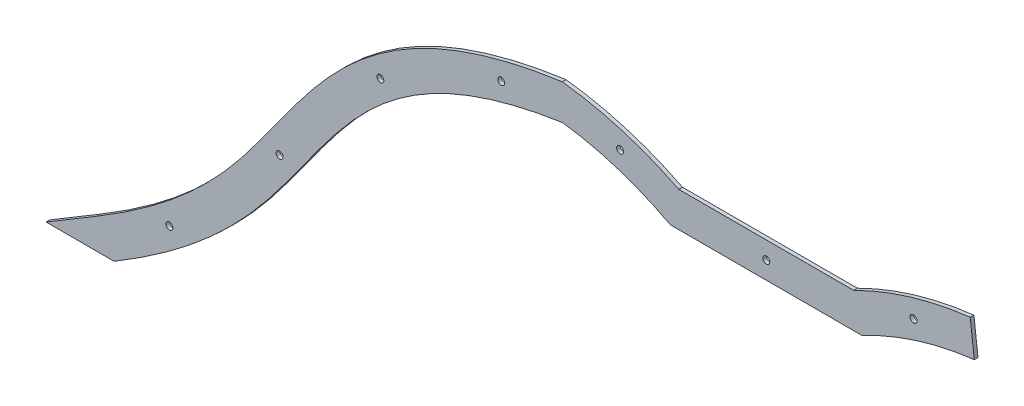
ISO-10303-21;
HEADER;
FILE_DESCRIPTION(('STEP AP214'),'2;1');
FILE_NAME('part.step','',(''),(''),'','','');
FILE_SCHEMA(('AUTOMOTIVE_DESIGN { 1 0 10303 214 1 1 1 1 }'));
ENDSEC;
DATA;
#1=APPLICATION_CONTEXT('core data for automotive mechanical design processes');
#2=APPLICATION_PROTOCOL_DEFINITION('international standard','automotive_design',2000,#1);
#3=PRODUCT_CONTEXT('',#1,'mechanical');
#4=PRODUCT('Part','Part','',(#3));
#5=PRODUCT_RELATED_PRODUCT_CATEGORY('part','',(#4));
#6=PRODUCT_DEFINITION_FORMATION('','',#4);
#7=PRODUCT_DEFINITION_CONTEXT('part definition',#1,'design');
#8=PRODUCT_DEFINITION('design','',#6,#7);
#9=PRODUCT_DEFINITION_SHAPE('','',#8);
#10=(LENGTH_UNIT() NAMED_UNIT(*) SI_UNIT(.MILLI.,.METRE.));
#11=(NAMED_UNIT(*) PLANE_ANGLE_UNIT() SI_UNIT($,.RADIAN.));
#12=(NAMED_UNIT(*) SI_UNIT($,.STERADIAN.) SOLID_ANGLE_UNIT());
#13=UNCERTAINTY_MEASURE_WITH_UNIT(LENGTH_MEASURE(1.E-05),#10,'distance_accuracy_value','');
#14=(GEOMETRIC_REPRESENTATION_CONTEXT(3) GLOBAL_UNCERTAINTY_ASSIGNED_CONTEXT((#13)) GLOBAL_UNIT_ASSIGNED_CONTEXT((#10,
#11,#12)) REPRESENTATION_CONTEXT('',''));
#15=CARTESIAN_POINT('',(0.,0.,0.));
#16=DIRECTION('',(0.,0.,1.));
#17=DIRECTION('',(1.,0.,0.));
#18=AXIS2_PLACEMENT_3D('',#15,#16,#17);
#19=CARTESIAN_POINT('',(-305.730376042937,66.0922491219474,3.175));
#20=DIRECTION('',(0.,0.,-1.));
#21=DIRECTION('',(-1.,0.,0.));
#22=AXIS2_PLACEMENT_3D('',#19,#20,#21);
#23=PLANE('',#22);
#24=CARTESIAN_POINT('',(226.311251147047,174.5053286279,3.175));
#25=DIRECTION('',(0.,0.,1.));
#26=DIRECTION('',(1.,0.,0.));
#27=AXIS2_PLACEMENT_3D('',#24,#25,#26);
#28=CIRCLE('',#27,2.99999999999999);
#29=CARTESIAN_POINT('',(229.311251147047,174.5053286279,3.175));
#30=VERTEX_POINT('',#29);
#31=EDGE_CURVE('E304',#30,#30,#28,.T.);
#32=ORIENTED_EDGE('',*,*,#31,.F.);
#33=EDGE_LOOP('',(#32));
#34=FACE_BOUND('',#33,.T.);
#35=CARTESIAN_POINT('',(-127.411512688745,174.255628939534,3.175));
#36=DIRECTION('',(0.,0.,1.));
#37=DIRECTION('',(1.,0.,0.));
#38=AXIS2_PLACEMENT_3D('',#35,#36,#37);
#39=CIRCLE('',#38,3.00000000000001);
#40=CARTESIAN_POINT('',(-124.411512688745,174.255628939534,3.175));
#41=VERTEX_POINT('',#40);
#42=EDGE_CURVE('E316',#41,#41,#39,.T.);
#43=ORIENTED_EDGE('',*,*,#42,.F.);
#44=EDGE_LOOP('',(#43));
#45=FACE_BOUND('',#44,.T.);
#46=CARTESIAN_POINT('',(-317.601811803088,24.2556289395343,3.175));
#47=DIRECTION('',(0.,0.,1.));
#48=DIRECTION('',(1.,0.,0.));
#49=AXIS2_PLACEMENT_3D('',#46,#47,#48);
#50=CIRCLE('',#49,2.99999999999999);
#51=CARTESIAN_POINT('',(-314.601811803088,24.2556289395343,3.175));
#52=VERTEX_POINT('',#51);
#53=EDGE_CURVE('E328',#52,#52,#50,.T.);
#54=ORIENTED_EDGE('',*,*,#53,.F.);
#55=EDGE_LOOP('',(#54));
#56=FACE_BOUND('',#55,.T.);
#57=CARTESIAN_POINT('',(-74.9999999999999,200.,3.175));
#58=CARTESIAN_POINT('',(-257.635554762002,174.287094015671,3.175));
#59=CARTESIAN_POINT('',(-306.013905785091,34.0368017017092,3.175));
#60=CARTESIAN_POINT('',(-419.540575808605,-66.8200706837091,3.175));
#61=CARTESIAN_POINT('',(-475.,-100.,3.175));
#62=B_SPLINE_CURVE_WITH_KNOTS('',3,(#57,#58,#59,#60,#61),.UNSPECIFIED.,.F.,.F.,(4,1,4),(0.,
0.687776101030099,1.),.UNSPECIFIED.);
#63=CARTESIAN_POINT('',(-75.0000000000001,200.,3.175));
#64=VERTEX_POINT('',#63);
#65=CARTESIAN_POINT('',(-475.,-100.,3.175));
#66=VERTEX_POINT('',#65);
#67=EDGE_CURVE('E180',#64,#66,#62,.T.);
#68=ORIENTED_EDGE('',*,*,#67,.T.);
#69=DIRECTION('',(-0.858145702015522,-0.513406227184953,0.));
#70=VECTOR('',#69,1.);
#71=CARTESIAN_POINT('',(-475.,-100.,3.175));
#72=LINE('',#71,#70);
#73=CARTESIAN_POINT('',(-518.031074043971,-125.744371060466,3.175));
#74=VERTEX_POINT('',#73);
#75=EDGE_CURVE('E103',#66,#74,#72,.T.);
#76=ORIENTED_EDGE('',*,*,#75,.T.);
#77=DIRECTION('',(1.,0.,0.));
#78=VECTOR('',#77,1.);
#79=CARTESIAN_POINT('',(-518.031074043971,-125.744371060466,3.175));
#80=LINE('',#79,#78);
#81=CARTESIAN_POINT('',(-459.597813184451,-125.744371060466,3.175));
#82=VERTEX_POINT('',#81);
#83=EDGE_CURVE('E204',#74,#82,#80,.T.);
#84=ORIENTED_EDGE('',*,*,#83,.T.);
#85=CARTESIAN_POINT('',(-459.597813184451,-125.744371060466,3.175));
#86=CARTESIAN_POINT('',(-458.167847661008,-124.888859924453,3.175));
#87=CARTESIAN_POINT('',(-455.300989910978,-123.160410803512,3.175));
#88=CARTESIAN_POINT('',(-449.693031194382,-119.725805066195,3.175));
#89=CARTESIAN_POINT('',(-442.844497858385,-115.430194442827,3.175));
#90=CARTESIAN_POINT('',(-434.897527212848,-110.280573748459,3.175));
#91=CARTESIAN_POINT('',(-424.643042918718,-103.410605597608,3.175));
#92=CARTESIAN_POINT('',(-412.446207366318,-94.8074073361384,3.175));
#93=CARTESIAN_POINT('',(-398.732866919874,-84.4254599712683,3.175));
#94=CARTESIAN_POINT('',(-385.875530013984,-73.9566558324273,3.175));
#95=CARTESIAN_POINT('',(-369.787206696001,-59.8500462059188,3.175));
#96=CARTESIAN_POINT('',(-355.152571956072,-45.4768028345298,3.175));
#97=CARTESIAN_POINT('',(-341.718077927236,-30.7847447708396,3.175));
#98=CARTESIAN_POINT('',(-332.160906415082,-19.5811865479318,3.175));
#99=CARTESIAN_POINT('',(-323.101555816333,-8.24103468343101,3.175));
#100=CARTESIAN_POINT('',(-311.63081691185,6.86364977739034,3.175));
#101=CARTESIAN_POINT('',(-298.117522757958,25.6059909159941,3.175));
#102=CARTESIAN_POINT('',(-282.395742384374,47.4315622052112,3.175));
#103=CARTESIAN_POINT('',(-266.384320483002,68.2509902397383,3.175));
#104=CARTESIAN_POINT('',(-249.341239770055,87.8033959609906,3.175));
#105=CARTESIAN_POINT('',(-230.504956306007,105.928130355789,3.175));
#106=CARTESIAN_POINT('',(-212.601243200538,119.77401821188,3.175));
#107=CARTESIAN_POINT('',(-196.457396920586,130.048920131079,3.175));
#108=CARTESIAN_POINT('',(-183.303935629057,137.332054250385,3.175));
#109=CARTESIAN_POINT('',(-168.969219752467,144.162376513778,3.175));
#110=CARTESIAN_POINT('',(-153.317967867507,150.500059010119,3.175));
#111=CARTESIAN_POINT('',(-136.218766866544,156.296597686252,3.175));
#112=CARTESIAN_POINT('',(-120.658812709165,160.629761276106,3.175));
#113=CARTESIAN_POINT('',(-107.364076992739,163.767973942765,3.175));
#114=CARTESIAN_POINT('',(-96.9585151839107,165.949209965446,3.175));
#115=CARTESIAN_POINT('',(-87.9034354353755,167.618170458525,3.175));
#116=CARTESIAN_POINT('',(-80.4452519010198,168.856738215602,3.175));
#117=CARTESIAN_POINT('',(-76.6048102728112,169.448930821223,3.175));
#118=CARTESIAN_POINT('',(-74.6960572886798,169.732215312606,3.175));
#119=B_SPLINE_CURVE_WITH_KNOTS('',3,(#85,#86,#87,#88,#89,#90,#91,#92,#93,#94,#95,#96,#97,#98,
#99,#100,#101,#102,#103,#104,#105,#106,#107,#108,#109,#110,#111,#112,#113,#114,#115,#116,#117,
#118),.UNSPECIFIED.,.F.,.F.,(4,1,1,1,1,1,1,1,1,1,1,1,1,1,1,1,1,1,1,1,1,1,1,1,1,1,1,1,1,1,1,4),
(0.,0.00777204129202768,0.0155440825840554,0.0310881651681107,0.0466322477521661,
0.0621763303362214,0.0932644955043321,0.124352660672443,0.155440825840554,0.186528991008664,
0.248705321344886,0.279793486512996,0.310881651681107,0.341969816849218,0.373057982017328,
0.43523431235355,0.497410642689771,0.559586973025993,0.621763303362214,0.683939633698435,
0.746115964034657,0.777204129202768,0.808292294370878,0.839380459538989,0.8704686247071,
0.90155678987521,0.932644955043321,0.948189037627376,0.963733120211432,0.979277202795487,
0.987049244087515,0.994821285379543),.UNSPECIFIED.);
#120=CARTESIAN_POINT('',(-74.6960572886798,169.732215312606,3.175));
#121=VERTEX_POINT('',#120);
#122=EDGE_CURVE('E223',#82,#121,#119,.T.);
#123=ORIENTED_EDGE('',*,*,#122,.T.);
#124=CARTESIAN_POINT('',(-109.889296501682,-97.9643216722729,3.175));
#125=DIRECTION('',(0.,0.,-1.));
#126=DIRECTION('',(-1.,0.,0.));
#127=AXIS2_PLACEMENT_3D('',#124,#125,#126);
#128=CIRCLE('',#127,270.);
#129=CARTESIAN_POINT('',(17.6763007847929,140.,3.175));
#130=VERTEX_POINT('',#129);
#131=EDGE_CURVE('E220',#121,#130,#128,.T.);
#132=ORIENTED_EDGE('',*,*,#131,.T.);
#133=DIRECTION('',(1.,0.,0.));
#134=VECTOR('',#133,1.);
#135=CARTESIAN_POINT('',(17.6763007847929,140.,3.175));
#136=LINE('',#135,#134);
#137=CARTESIAN_POINT('',(182.323699215207,140.,3.175));
#138=VERTEX_POINT('',#137);
#139=EDGE_CURVE('E222',#130,#138,#136,.T.);
#140=ORIENTED_EDGE('',*,*,#139,.T.);
#141=CARTESIAN_POINT('',(309.889296501682,-97.9643216722729,3.175));
#142=DIRECTION('',(0.,0.,-1.));
#143=DIRECTION('',(-1.,0.,0.));
#144=AXIS2_PLACEMENT_3D('',#141,#142,#143);
#145=CIRCLE('',#144,270.);
#146=CARTESIAN_POINT('',(278.488929650168,170.203567832773,3.175));
#147=VERTEX_POINT('',#146);
#148=EDGE_CURVE('E225',#138,#147,#145,.T.);
#149=ORIENTED_EDGE('',*,*,#148,.T.);
#150=DIRECTION('',(-0.116297655005604,0.993214405574243,0.));
#151=VECTOR('',#150,1.);
#152=CARTESIAN_POINT('',(278.488929650168,170.203567832773,3.175));
#153=LINE('',#152,#151);
#154=CARTESIAN_POINT('',(275.,200.,3.175));
#155=VERTEX_POINT('',#154);
#156=EDGE_CURVE('E131',#147,#155,#153,.T.);
#157=ORIENTED_EDGE('',*,*,#156,.T.);
#158=CARTESIAN_POINT('',(309.889296501682,-97.9643216722729,3.175));
#159=DIRECTION('',(0.,0.,1.));
#160=DIRECTION('',(-1.,0.,0.));
#161=AXIS2_PLACEMENT_3D('',#158,#159,#160);
#162=CIRCLE('',#161,300.);
#163=CARTESIAN_POINT('',(175.,170.,3.175));
#164=VERTEX_POINT('',#163);
#165=EDGE_CURVE('E125',#155,#164,#162,.T.);
#166=ORIENTED_EDGE('',*,*,#165,.T.);
#167=DIRECTION('',(-1.,0.,0.));
#168=VECTOR('',#167,1.);
#169=CARTESIAN_POINT('',(25.,170.,3.175));
#170=LINE('',#169,#168);
#171=CARTESIAN_POINT('',(25.,170.,3.175));
#172=VERTEX_POINT('',#171);
#173=EDGE_CURVE('E129',#164,#172,#170,.T.);
#174=ORIENTED_EDGE('',*,*,#173,.T.);
#175=CARTESIAN_POINT('',(-109.889296501682,-97.9643216722729,3.175));
#176=DIRECTION('',(0.,0.,1.));
#177=DIRECTION('',(-1.,0.,0.));
#178=AXIS2_PLACEMENT_3D('',#175,#176,#177);
#179=CIRCLE('',#178,300.);
#180=EDGE_CURVE('E51',#172,#64,#179,.T.);
#181=ORIENTED_EDGE('',*,*,#180,.T.);
#182=EDGE_LOOP('',(#68,#76,#84,#123,#132,#140,#149,#157,#166,#174,#181));
#183=FACE_BOUND('',#182,.T.);
#184=CARTESIAN_POINT('',(-412.17449942756,-75.7443710604656,3.175));
#185=DIRECTION('',(0.,0.,1.));
#186=DIRECTION('',(1.,0.,0.));
#187=AXIS2_PLACEMENT_3D('',#184,#185,#186);
#188=CIRCLE('',#187,2.99999999999999);
#189=CARTESIAN_POINT('',(-409.17449942756,-75.7443710604656,3.175));
#190=VERTEX_POINT('',#189);
#191=EDGE_CURVE('E155',#190,#190,#188,.T.);
#192=ORIENTED_EDGE('',*,*,#191,.F.);
#193=EDGE_LOOP('',(#192));
#194=FACE_BOUND('',#193,.T.);
#195=CARTESIAN_POINT('',(-231.096695012499,124.255628939534,3.175));
#196=DIRECTION('',(0.,0.,1.));
#197=DIRECTION('',(1.,0.,0.));
#198=AXIS2_PLACEMENT_3D('',#195,#196,#197);
#199=CIRCLE('',#198,2.99999999999999);
#200=CARTESIAN_POINT('',(-228.096695012499,124.255628939534,3.175));
#201=VERTEX_POINT('',#200);
#202=EDGE_CURVE('E322',#201,#201,#199,.T.);
#203=ORIENTED_EDGE('',*,*,#202,.F.);
#204=EDGE_LOOP('',(#203));
#205=FACE_BOUND('',#204,.T.);
#206=CARTESIAN_POINT('',(100.,155.,3.175));
#207=DIRECTION('',(0.,0.,1.));
#208=DIRECTION('',(1.,0.,0.));
#209=AXIS2_PLACEMENT_3D('',#206,#207,#208);
#210=CIRCLE('',#209,3.00000000000001);
#211=CARTESIAN_POINT('',(103.,155.,3.175));
#212=VERTEX_POINT('',#211);
#213=EDGE_CURVE('E310',#212,#212,#210,.T.);
#214=ORIENTED_EDGE('',*,*,#213,.F.);
#215=EDGE_LOOP('',(#214));
#216=FACE_BOUND('',#215,.T.);
#217=CARTESIAN_POINT('',(-25.3925832180808,174.221837866137,3.175));
#218=DIRECTION('',(0.,0.,1.));
#219=DIRECTION('',(1.,0.,0.));
#220=AXIS2_PLACEMENT_3D('',#217,#218,#219);
#221=CIRCLE('',#220,3.);
#222=CARTESIAN_POINT('',(-22.3925832180808,174.221837866137,3.175));
#223=VERTEX_POINT('',#222);
#224=EDGE_CURVE('E295',#223,#223,#221,.T.);
#225=ORIENTED_EDGE('',*,*,#224,.F.);
#226=EDGE_LOOP('',(#225));
#227=FACE_BOUND('',#226,.T.);
#228=ADVANCED_FACE('F33',(#34,#45,#56,#183,#194,#205,#216,#227),#23,.F.);
#229=CARTESIAN_POINT('',(-305.730376042937,66.0922491219474,0.));
#230=DIRECTION('',(0.,0.,-1.));
#231=DIRECTION('',(-1.,0.,0.));
#232=AXIS2_PLACEMENT_3D('',#229,#230,#231);
#233=PLANE('',#232);
#234=CARTESIAN_POINT('',(226.311251147047,174.5053286279,0.));
#235=DIRECTION('',(0.,0.,1.));
#236=DIRECTION('',(1.,0.,0.));
#237=AXIS2_PLACEMENT_3D('',#234,#235,#236);
#238=CIRCLE('',#237,2.99999999999999);
#239=CARTESIAN_POINT('',(229.311251147047,174.5053286279,0.));
#240=VERTEX_POINT('',#239);
#241=EDGE_CURVE('E301',#240,#240,#238,.T.);
#242=ORIENTED_EDGE('',*,*,#241,.T.);
#243=EDGE_LOOP('',(#242));
#244=FACE_BOUND('',#243,.T.);
#245=CARTESIAN_POINT('',(-127.411512688745,174.255628939534,0.));
#246=DIRECTION('',(0.,0.,1.));
#247=DIRECTION('',(1.,0.,0.));
#248=AXIS2_PLACEMENT_3D('',#245,#246,#247);
#249=CIRCLE('',#248,3.00000000000001);
#250=CARTESIAN_POINT('',(-124.411512688745,174.255628939534,0.));
#251=VERTEX_POINT('',#250);
#252=EDGE_CURVE('E313',#251,#251,#249,.T.);
#253=ORIENTED_EDGE('',*,*,#252,.T.);
#254=EDGE_LOOP('',(#253));
#255=FACE_BOUND('',#254,.T.);
#256=CARTESIAN_POINT('',(-317.601811803088,24.2556289395343,0.));
#257=DIRECTION('',(0.,0.,1.));
#258=DIRECTION('',(1.,0.,0.));
#259=AXIS2_PLACEMENT_3D('',#256,#257,#258);
#260=CIRCLE('',#259,2.99999999999999);
#261=CARTESIAN_POINT('',(-314.601811803088,24.2556289395343,0.));
#262=VERTEX_POINT('',#261);
#263=EDGE_CURVE('E325',#262,#262,#260,.T.);
#264=ORIENTED_EDGE('',*,*,#263,.T.);
#265=EDGE_LOOP('',(#264));
#266=FACE_BOUND('',#265,.T.);
#267=CARTESIAN_POINT('',(-74.9999999999999,200.,0.));
#268=CARTESIAN_POINT('',(-257.635554762002,174.287094015671,0.));
#269=CARTESIAN_POINT('',(-306.013905785091,34.0368017017092,0.));
#270=CARTESIAN_POINT('',(-419.540575808605,-66.8200706837091,0.));
#271=CARTESIAN_POINT('',(-475.,-100.,0.));
#272=B_SPLINE_CURVE_WITH_KNOTS('',3,(#267,#268,#269,#270,#271),.UNSPECIFIED.,.F.,.F.,(4,1,4),
(0.,0.687776101030099,1.),.UNSPECIFIED.);
#273=CARTESIAN_POINT('',(-75.0000000000001,200.,0.));
#274=VERTEX_POINT('',#273);
#275=CARTESIAN_POINT('',(-475.,-100.,0.));
#276=VERTEX_POINT('',#275);
#277=EDGE_CURVE('E149',#274,#276,#272,.T.);
#278=ORIENTED_EDGE('',*,*,#277,.F.);
#279=CARTESIAN_POINT('',(-109.889296501682,-97.9643216722729,0.));
#280=DIRECTION('',(0.,0.,1.));
#281=DIRECTION('',(-1.,0.,0.));
#282=AXIS2_PLACEMENT_3D('',#279,#280,#281);
#283=CIRCLE('',#282,300.);
#284=CARTESIAN_POINT('',(25.,170.,0.));
#285=VERTEX_POINT('',#284);
#286=EDGE_CURVE('E95',#285,#274,#283,.T.);
#287=ORIENTED_EDGE('',*,*,#286,.F.);
#288=DIRECTION('',(-1.,0.,0.));
#289=VECTOR('',#288,1.);
#290=CARTESIAN_POINT('',(25.,170.,0.));
#291=LINE('',#290,#289);
#292=CARTESIAN_POINT('',(175.,170.,0.));
#293=VERTEX_POINT('',#292);
#294=EDGE_CURVE('E89',#293,#285,#291,.T.);
#295=ORIENTED_EDGE('',*,*,#294,.F.);
#296=CARTESIAN_POINT('',(309.889296501682,-97.9643216722729,0.));
#297=DIRECTION('',(0.,0.,1.));
#298=DIRECTION('',(-1.,0.,0.));
#299=AXIS2_PLACEMENT_3D('',#296,#297,#298);
#300=CIRCLE('',#299,300.);
#301=CARTESIAN_POINT('',(275.,200.,0.));
#302=VERTEX_POINT('',#301);
#303=EDGE_CURVE('E139',#302,#293,#300,.T.);
#304=ORIENTED_EDGE('',*,*,#303,.F.);
#305=DIRECTION('',(-0.116297655005604,0.993214405574243,0.));
#306=VECTOR('',#305,1.);
#307=CARTESIAN_POINT('',(278.488929650168,170.203567832773,0.));
#308=LINE('',#307,#306);
#309=CARTESIAN_POINT('',(278.488929650168,170.203567832773,0.));
#310=VERTEX_POINT('',#309);
#311=EDGE_CURVE('E175',#310,#302,#308,.T.);
#312=ORIENTED_EDGE('',*,*,#311,.F.);
#313=CARTESIAN_POINT('',(309.889296501682,-97.9643216722729,0.));
#314=DIRECTION('',(0.,0.,-1.));
#315=DIRECTION('',(-1.,0.,0.));
#316=AXIS2_PLACEMENT_3D('',#313,#314,#315);
#317=CIRCLE('',#316,270.);
#318=CARTESIAN_POINT('',(182.323699215207,140.,0.));
#319=VERTEX_POINT('',#318);
#320=EDGE_CURVE('E173',#319,#310,#317,.T.);
#321=ORIENTED_EDGE('',*,*,#320,.F.);
#322=DIRECTION('',(1.,0.,0.));
#323=VECTOR('',#322,1.);
#324=CARTESIAN_POINT('',(17.6763007847929,140.,0.));
#325=LINE('',#324,#323);
#326=CARTESIAN_POINT('',(17.6763007847929,140.,0.));
#327=VERTEX_POINT('',#326);
#328=EDGE_CURVE('E171',#327,#319,#325,.T.);
#329=ORIENTED_EDGE('',*,*,#328,.F.);
#330=CARTESIAN_POINT('',(-109.889296501682,-97.9643216722729,0.));
#331=DIRECTION('',(0.,0.,-1.));
#332=DIRECTION('',(-1.,0.,0.));
#333=AXIS2_PLACEMENT_3D('',#330,#331,#332);
#334=CIRCLE('',#333,270.);
#335=CARTESIAN_POINT('',(-74.6960572886798,169.732215312606,0.));
#336=VERTEX_POINT('',#335);
#337=EDGE_CURVE('E166',#336,#327,#334,.T.);
#338=ORIENTED_EDGE('',*,*,#337,.F.);
#339=CARTESIAN_POINT('',(-459.597813184451,-125.744371060466,0.));
#340=CARTESIAN_POINT('',(-458.167847661008,-124.888859924453,0.));
#341=CARTESIAN_POINT('',(-455.300989910978,-123.160410803512,0.));
#342=CARTESIAN_POINT('',(-449.693031194382,-119.725805066195,0.));
#343=CARTESIAN_POINT('',(-442.844497858385,-115.430194442827,0.));
#344=CARTESIAN_POINT('',(-434.897527212848,-110.280573748459,0.));
#345=CARTESIAN_POINT('',(-424.643042918718,-103.410605597608,0.));
#346=CARTESIAN_POINT('',(-412.446207366318,-94.8074073361384,0.));
#347=CARTESIAN_POINT('',(-398.732866919874,-84.4254599712683,0.));
#348=CARTESIAN_POINT('',(-385.875530013984,-73.9566558324273,0.));
#349=CARTESIAN_POINT('',(-369.787206696001,-59.8500462059188,0.));
#350=CARTESIAN_POINT('',(-355.152571956072,-45.4768028345298,0.));
#351=CARTESIAN_POINT('',(-341.718077927236,-30.7847447708396,0.));
#352=CARTESIAN_POINT('',(-332.160906415082,-19.5811865479318,0.));
#353=CARTESIAN_POINT('',(-323.101555816333,-8.24103468343101,0.));
#354=CARTESIAN_POINT('',(-311.63081691185,6.86364977739034,0.));
#355=CARTESIAN_POINT('',(-298.117522757958,25.6059909159941,0.));
#356=CARTESIAN_POINT('',(-282.395742384374,47.4315622052112,0.));
#357=CARTESIAN_POINT('',(-266.384320483002,68.2509902397383,0.));
#358=CARTESIAN_POINT('',(-249.341239770055,87.8033959609906,0.));
#359=CARTESIAN_POINT('',(-230.504956306007,105.928130355789,0.));
#360=CARTESIAN_POINT('',(-212.601243200538,119.77401821188,0.));
#361=CARTESIAN_POINT('',(-196.457396920586,130.048920131079,0.));
#362=CARTESIAN_POINT('',(-183.303935629057,137.332054250385,0.));
#363=CARTESIAN_POINT('',(-168.969219752467,144.162376513778,0.));
#364=CARTESIAN_POINT('',(-153.317967867507,150.500059010119,0.));
#365=CARTESIAN_POINT('',(-136.218766866544,156.296597686252,0.));
#366=CARTESIAN_POINT('',(-120.658812709165,160.629761276106,0.));
#367=CARTESIAN_POINT('',(-107.364076992739,163.767973942765,0.));
#368=CARTESIAN_POINT('',(-96.9585151839107,165.949209965446,0.));
#369=CARTESIAN_POINT('',(-87.9034354353755,167.618170458525,0.));
#370=CARTESIAN_POINT('',(-80.4452519010198,168.856738215602,0.));
#371=CARTESIAN_POINT('',(-76.6048102728112,169.448930821223,0.));
#372=CARTESIAN_POINT('',(-74.6960572886798,169.732215312606,0.));
#373=B_SPLINE_CURVE_WITH_KNOTS('',3,(#339,#340,#341,#342,#343,#344,#345,#346,#347,#348,#349,
#350,#351,#352,#353,#354,#355,#356,#357,#358,#359,#360,#361,#362,#363,#364,#365,#366,#367,#368,
#369,#370,#371,#372),.UNSPECIFIED.,.F.,.F.,(4,1,1,1,1,1,1,1,1,1,1,1,1,1,1,1,1,1,1,1,1,1,1,1,1,1,
1,1,1,1,1,4),(0.,0.00777204129202768,0.0155440825840554,0.0310881651681107,0.0466322477521661,
0.0621763303362214,0.0932644955043321,0.124352660672443,0.155440825840554,0.186528991008664,
0.248705321344886,0.279793486512996,0.310881651681107,0.341969816849218,0.373057982017328,
0.43523431235355,0.497410642689771,0.559586973025993,0.621763303362214,0.683939633698435,
0.746115964034657,0.777204129202768,0.808292294370878,0.839380459538989,0.8704686247071,
0.90155678987521,0.932644955043321,0.948189037627376,0.963733120211432,0.979277202795487,
0.987049244087515,0.994821285379543),.UNSPECIFIED.);
#374=CARTESIAN_POINT('',(-459.597813184451,-125.744371060466,0.));
#375=VERTEX_POINT('',#374);
#376=EDGE_CURVE('E162',#375,#336,#373,.T.);
#377=ORIENTED_EDGE('',*,*,#376,.F.);
#378=DIRECTION('',(1.,0.,0.));
#379=VECTOR('',#378,1.);
#380=CARTESIAN_POINT('',(-518.031074043971,-125.744371060466,0.));
#381=LINE('',#380,#379);
#382=CARTESIAN_POINT('',(-518.031074043971,-125.744371060466,0.));
#383=VERTEX_POINT('',#382);
#384=EDGE_CURVE('E160',#383,#375,#381,.T.);
#385=ORIENTED_EDGE('',*,*,#384,.F.);
#386=DIRECTION('',(-0.858145702015522,-0.513406227184953,0.));
#387=VECTOR('',#386,1.);
#388=CARTESIAN_POINT('',(-475.,-100.,0.));
#389=LINE('',#388,#387);
#390=EDGE_CURVE('E154',#276,#383,#389,.T.);
#391=ORIENTED_EDGE('',*,*,#390,.F.);
#392=EDGE_LOOP('',(#278,#287,#295,#304,#312,#321,#329,#338,#377,#385,#391));
#393=FACE_BOUND('',#392,.T.);
#394=CARTESIAN_POINT('',(-412.17449942756,-75.7443710604656,0.));
#395=DIRECTION('',(0.,0.,1.));
#396=DIRECTION('',(1.,0.,0.));
#397=AXIS2_PLACEMENT_3D('',#394,#395,#396);
#398=CIRCLE('',#397,2.99999999999999);
#399=CARTESIAN_POINT('',(-409.17449942756,-75.7443710604656,0.));
#400=VERTEX_POINT('',#399);
#401=EDGE_CURVE('E331',#400,#400,#398,.T.);
#402=ORIENTED_EDGE('',*,*,#401,.T.);
#403=EDGE_LOOP('',(#402));
#404=FACE_BOUND('',#403,.T.);
#405=CARTESIAN_POINT('',(-231.096695012499,124.255628939534,0.));
#406=DIRECTION('',(0.,0.,1.));
#407=DIRECTION('',(1.,0.,0.));
#408=AXIS2_PLACEMENT_3D('',#405,#406,#407);
#409=CIRCLE('',#408,2.99999999999999);
#410=CARTESIAN_POINT('',(-228.096695012499,124.255628939534,0.));
#411=VERTEX_POINT('',#410);
#412=EDGE_CURVE('E319',#411,#411,#409,.T.);
#413=ORIENTED_EDGE('',*,*,#412,.T.);
#414=EDGE_LOOP('',(#413));
#415=FACE_BOUND('',#414,.T.);
#416=CARTESIAN_POINT('',(100.,155.,0.));
#417=DIRECTION('',(0.,0.,1.));
#418=DIRECTION('',(1.,0.,0.));
#419=AXIS2_PLACEMENT_3D('',#416,#417,#418);
#420=CIRCLE('',#419,3.00000000000001);
#421=CARTESIAN_POINT('',(103.,155.,0.));
#422=VERTEX_POINT('',#421);
#423=EDGE_CURVE('E307',#422,#422,#420,.T.);
#424=ORIENTED_EDGE('',*,*,#423,.T.);
#425=EDGE_LOOP('',(#424));
#426=FACE_BOUND('',#425,.T.);
#427=CARTESIAN_POINT('',(-25.3925832180808,174.221837866137,0.));
#428=DIRECTION('',(0.,0.,1.));
#429=DIRECTION('',(1.,0.,0.));
#430=AXIS2_PLACEMENT_3D('',#427,#428,#429);
#431=CIRCLE('',#430,3.);
#432=CARTESIAN_POINT('',(-22.3925832180808,174.221837866137,0.));
#433=VERTEX_POINT('',#432);
#434=EDGE_CURVE('E298',#433,#433,#431,.T.);
#435=ORIENTED_EDGE('',*,*,#434,.T.);
#436=EDGE_LOOP('',(#435));
#437=FACE_BOUND('',#436,.T.);
#438=ADVANCED_FACE('F208',(#244,#255,#266,#393,#404,#415,#426,#437),#233,.T.);
#439=DIRECTION('',(0.,0.,-1.));
#440=VECTOR('',#439,1.);
#441=SURFACE_OF_LINEAR_EXTRUSION('',#62,#440);
#442=ORIENTED_EDGE('',*,*,#277,.T.);
#443=DIRECTION('',(0.,0.,-1.));
#444=VECTOR('',#443,1.);
#445=CARTESIAN_POINT('',(-475.,-100.,3.175));
#446=LINE('',#445,#444);
#447=EDGE_CURVE('E11',#66,#276,#446,.T.);
#448=ORIENTED_EDGE('',*,*,#447,.F.);
#449=ORIENTED_EDGE('',*,*,#67,.F.);
#450=DIRECTION('',(0.,0.,-1.));
#451=VECTOR('',#450,1.);
#452=CARTESIAN_POINT('',(-75.0000000000001,200.,3.175));
#453=LINE('',#452,#451);
#454=EDGE_CURVE('E145',#64,#274,#453,.T.);
#455=ORIENTED_EDGE('',*,*,#454,.T.);
#456=EDGE_LOOP('',(#442,#448,#449,#455));
#457=FACE_BOUND('',#456,.T.);
#458=ADVANCED_FACE('F35',(#457),#441,.F.);
#459=CARTESIAN_POINT('',(-475.,-100.,3.175));
#460=DIRECTION('',(0.513406227184953,-0.858145702015522,0.));
#461=DIRECTION('',(0.858145702015522,0.513406227184953,0.));
#462=AXIS2_PLACEMENT_3D('',#459,#460,#461);
#463=PLANE('',#462);
#464=ORIENTED_EDGE('',*,*,#390,.T.);
#465=DIRECTION('',(0.,0.,-1.));
#466=VECTOR('',#465,1.);
#467=CARTESIAN_POINT('',(-518.031074043971,-125.744371060466,3.175));
#468=LINE('',#467,#466);
#469=EDGE_CURVE('E43',#74,#383,#468,.T.);
#470=ORIENTED_EDGE('',*,*,#469,.F.);
#471=ORIENTED_EDGE('',*,*,#75,.F.);
#472=ORIENTED_EDGE('',*,*,#447,.T.);
#473=EDGE_LOOP('',(#464,#470,#471,#472));
#474=FACE_BOUND('',#473,.T.);
#475=ADVANCED_FACE('F462',(#474),#463,.F.);
#476=CARTESIAN_POINT('',(-518.031074043971,-125.744371060466,3.175));
#477=DIRECTION('',(0.,1.,0.));
#478=DIRECTION('',(0.,0.,1.));
#479=AXIS2_PLACEMENT_3D('',#476,#477,#478);
#480=PLANE('',#479);
#481=ORIENTED_EDGE('',*,*,#384,.T.);
#482=DIRECTION('',(0.,0.,-1.));
#483=VECTOR('',#482,1.);
#484=CARTESIAN_POINT('',(-459.597813184451,-125.744371060466,3.175));
#485=LINE('',#484,#483);
#486=EDGE_CURVE('E196',#82,#375,#485,.T.);
#487=ORIENTED_EDGE('',*,*,#486,.F.);
#488=ORIENTED_EDGE('',*,*,#83,.F.);
#489=ORIENTED_EDGE('',*,*,#469,.T.);
#490=EDGE_LOOP('',(#481,#487,#488,#489));
#491=FACE_BOUND('',#490,.T.);
#492=ADVANCED_FACE('F202',(#491),#480,.F.);
#493=DIRECTION('',(0.,0.,-1.));
#494=VECTOR('',#493,1.);
#495=SURFACE_OF_LINEAR_EXTRUSION('',#119,#494);
#496=ORIENTED_EDGE('',*,*,#376,.T.);
#497=DIRECTION('',(0.,0.,-1.));
#498=VECTOR('',#497,1.);
#499=CARTESIAN_POINT('',(-74.6960572886798,169.732215312606,3.175));
#500=LINE('',#499,#498);
#501=EDGE_CURVE('E193',#121,#336,#500,.T.);
#502=ORIENTED_EDGE('',*,*,#501,.F.);
#503=ORIENTED_EDGE('',*,*,#122,.F.);
#504=ORIENTED_EDGE('',*,*,#486,.T.);
#505=EDGE_LOOP('',(#496,#502,#503,#504));
#506=FACE_BOUND('',#505,.T.);
#507=ADVANCED_FACE('F214',(#506),#495,.F.);
#508=CARTESIAN_POINT('',(-109.889296501682,-97.9643216722729,3.175));
#509=DIRECTION('',(0.,0.,-1.));
#510=DIRECTION('',(-1.,0.,0.));
#511=AXIS2_PLACEMENT_3D('',#508,#509,#510);
#512=CYLINDRICAL_SURFACE('',#511,270.);
#513=ORIENTED_EDGE('',*,*,#337,.T.);
#514=DIRECTION('',(0.,0.,-1.));
#515=VECTOR('',#514,1.);
#516=CARTESIAN_POINT('',(17.6763007847929,140.,3.175));
#517=LINE('',#516,#515);
#518=EDGE_CURVE('E190',#130,#327,#517,.T.);
#519=ORIENTED_EDGE('',*,*,#518,.F.);
#520=ORIENTED_EDGE('',*,*,#131,.F.);
#521=ORIENTED_EDGE('',*,*,#501,.T.);
#522=EDGE_LOOP('',(#513,#519,#520,#521));
#523=FACE_BOUND('',#522,.T.);
#524=ADVANCED_FACE('F218',(#523),#512,.F.);
#525=CARTESIAN_POINT('',(17.6763007847929,140.,3.175));
#526=DIRECTION('',(0.,1.,0.));
#527=DIRECTION('',(0.,0.,1.));
#528=AXIS2_PLACEMENT_3D('',#525,#526,#527);
#529=PLANE('',#528);
#530=ORIENTED_EDGE('',*,*,#328,.T.);
#531=DIRECTION('',(0.,0.,-1.));
#532=VECTOR('',#531,1.);
#533=CARTESIAN_POINT('',(182.323699215207,140.,3.175));
#534=LINE('',#533,#532);
#535=EDGE_CURVE('E187',#138,#319,#534,.T.);
#536=ORIENTED_EDGE('',*,*,#535,.F.);
#537=ORIENTED_EDGE('',*,*,#139,.F.);
#538=ORIENTED_EDGE('',*,*,#518,.T.);
#539=EDGE_LOOP('',(#530,#536,#537,#538));
#540=FACE_BOUND('',#539,.T.);
#541=ADVANCED_FACE('F428',(#540),#529,.F.);
#542=CARTESIAN_POINT('',(309.889296501682,-97.9643216722729,3.175));
#543=DIRECTION('',(0.,0.,-1.));
#544=DIRECTION('',(-1.,0.,0.));
#545=AXIS2_PLACEMENT_3D('',#542,#543,#544);
#546=CYLINDRICAL_SURFACE('',#545,270.);
#547=ORIENTED_EDGE('',*,*,#320,.T.);
#548=DIRECTION('',(0.,0.,-1.));
#549=VECTOR('',#548,1.);
#550=CARTESIAN_POINT('',(278.488929650168,170.203567832773,3.175));
#551=LINE('',#550,#549);
#552=EDGE_CURVE('E184',#147,#310,#551,.T.);
#553=ORIENTED_EDGE('',*,*,#552,.F.);
#554=ORIENTED_EDGE('',*,*,#148,.F.);
#555=ORIENTED_EDGE('',*,*,#535,.T.);
#556=EDGE_LOOP('',(#547,#553,#554,#555));
#557=FACE_BOUND('',#556,.T.);
#558=ADVANCED_FACE('F237',(#557),#546,.F.);
#559=CARTESIAN_POINT('',(278.488929650168,170.203567832773,3.175));
#560=DIRECTION('',(-0.993214405574243,-0.116297655005604,0.));
#561=DIRECTION('',(0.116297655005604,-0.993214405574243,0.));
#562=AXIS2_PLACEMENT_3D('',#559,#560,#561);
#563=PLANE('',#562);
#564=ORIENTED_EDGE('',*,*,#311,.T.);
#565=DIRECTION('',(0.,0.,-1.));
#566=VECTOR('',#565,1.);
#567=CARTESIAN_POINT('',(275.,200.,3.175));
#568=LINE('',#567,#566);
#569=EDGE_CURVE('E140',#155,#302,#568,.T.);
#570=ORIENTED_EDGE('',*,*,#569,.F.);
#571=ORIENTED_EDGE('',*,*,#156,.F.);
#572=ORIENTED_EDGE('',*,*,#552,.T.);
#573=EDGE_LOOP('',(#564,#570,#571,#572));
#574=FACE_BOUND('',#573,.T.);
#575=ADVANCED_FACE('F241',(#574),#563,.F.);
#576=CARTESIAN_POINT('',(309.889296501682,-97.9643216722729,3.175));
#577=DIRECTION('',(0.,0.,-1.));
#578=DIRECTION('',(-1.,0.,0.));
#579=AXIS2_PLACEMENT_3D('',#576,#577,#578);
#580=CYLINDRICAL_SURFACE('',#579,300.);
#581=ORIENTED_EDGE('',*,*,#303,.T.);
#582=DIRECTION('',(0.,0.,-1.));
#583=VECTOR('',#582,1.);
#584=CARTESIAN_POINT('',(175.,170.,3.175));
#585=LINE('',#584,#583);
#586=EDGE_CURVE('E136',#164,#293,#585,.T.);
#587=ORIENTED_EDGE('',*,*,#586,.F.);
#588=ORIENTED_EDGE('',*,*,#165,.F.);
#589=ORIENTED_EDGE('',*,*,#569,.T.);
#590=EDGE_LOOP('',(#581,#587,#588,#589));
#591=FACE_BOUND('',#590,.T.);
#592=ADVANCED_FACE('F137',(#591),#580,.T.);
#593=CARTESIAN_POINT('',(25.,170.,3.175));
#594=DIRECTION('',(0.,-1.,0.));
#595=DIRECTION('',(0.,0.,-1.));
#596=AXIS2_PLACEMENT_3D('',#593,#594,#595);
#597=PLANE('',#596);
#598=ORIENTED_EDGE('',*,*,#294,.T.);
#599=DIRECTION('',(0.,0.,-1.));
#600=VECTOR('',#599,1.);
#601=CARTESIAN_POINT('',(25.,170.,3.175));
#602=LINE('',#601,#600);
#603=EDGE_CURVE('E141',#172,#285,#602,.T.);
#604=ORIENTED_EDGE('',*,*,#603,.F.);
#605=ORIENTED_EDGE('',*,*,#173,.F.);
#606=ORIENTED_EDGE('',*,*,#586,.T.);
#607=EDGE_LOOP('',(#598,#604,#605,#606));
#608=FACE_BOUND('',#607,.T.);
#609=ADVANCED_FACE('F143',(#608),#597,.F.);
#610=CARTESIAN_POINT('',(-109.889296501682,-97.9643216722729,3.175));
#611=DIRECTION('',(0.,0.,-1.));
#612=DIRECTION('',(-1.,0.,0.));
#613=AXIS2_PLACEMENT_3D('',#610,#611,#612);
#614=CYLINDRICAL_SURFACE('',#613,300.);
#615=ORIENTED_EDGE('',*,*,#286,.T.);
#616=ORIENTED_EDGE('',*,*,#454,.F.);
#617=ORIENTED_EDGE('',*,*,#180,.F.);
#618=ORIENTED_EDGE('',*,*,#603,.T.);
#619=EDGE_LOOP('',(#615,#616,#617,#618));
#620=FACE_BOUND('',#619,.T.);
#621=ADVANCED_FACE('F245',(#620),#614,.T.);
#622=CARTESIAN_POINT('',(-412.17449942756,-75.7443710604656,3.175));
#623=DIRECTION('',(0.,0.,-1.));
#624=DIRECTION('',(-1.,0.,0.));
#625=AXIS2_PLACEMENT_3D('',#622,#623,#624);
#626=CYLINDRICAL_SURFACE('',#625,2.99999999999999);
#627=ORIENTED_EDGE('',*,*,#191,.T.);
#628=EDGE_LOOP('',(#627));
#629=FACE_BOUND('',#628,.T.);
#630=ORIENTED_EDGE('',*,*,#401,.F.);
#631=EDGE_LOOP('',(#630));
#632=FACE_BOUND('',#631,.T.);
#633=ADVANCED_FACE('F247',(#629,#632),#626,.F.);
#634=CARTESIAN_POINT('',(-317.601811803088,24.2556289395343,3.175));
#635=DIRECTION('',(0.,0.,-1.));
#636=DIRECTION('',(-1.,0.,0.));
#637=AXIS2_PLACEMENT_3D('',#634,#635,#636);
#638=CYLINDRICAL_SURFACE('',#637,2.99999999999999);
#639=ORIENTED_EDGE('',*,*,#53,.T.);
#640=EDGE_LOOP('',(#639));
#641=FACE_BOUND('',#640,.T.);
#642=ORIENTED_EDGE('',*,*,#263,.F.);
#643=EDGE_LOOP('',(#642));
#644=FACE_BOUND('',#643,.T.);
#645=ADVANCED_FACE('F253',(#641,#644),#638,.F.);
#646=CARTESIAN_POINT('',(-231.096695012499,124.255628939534,3.175));
#647=DIRECTION('',(0.,0.,-1.));
#648=DIRECTION('',(-1.,0.,0.));
#649=AXIS2_PLACEMENT_3D('',#646,#647,#648);
#650=CYLINDRICAL_SURFACE('',#649,2.99999999999999);
#651=ORIENTED_EDGE('',*,*,#202,.T.);
#652=EDGE_LOOP('',(#651));
#653=FACE_BOUND('',#652,.T.);
#654=ORIENTED_EDGE('',*,*,#412,.F.);
#655=EDGE_LOOP('',(#654));
#656=FACE_BOUND('',#655,.T.);
#657=ADVANCED_FACE('F270',(#653,#656),#650,.F.);
#658=CARTESIAN_POINT('',(-127.411512688745,174.255628939534,3.175));
#659=DIRECTION('',(0.,0.,-1.));
#660=DIRECTION('',(-1.,0.,0.));
#661=AXIS2_PLACEMENT_3D('',#658,#659,#660);
#662=CYLINDRICAL_SURFACE('',#661,3.00000000000001);
#663=ORIENTED_EDGE('',*,*,#42,.T.);
#664=EDGE_LOOP('',(#663));
#665=FACE_BOUND('',#664,.T.);
#666=ORIENTED_EDGE('',*,*,#252,.F.);
#667=EDGE_LOOP('',(#666));
#668=FACE_BOUND('',#667,.T.);
#669=ADVANCED_FACE('F274',(#665,#668),#662,.F.);
#670=CARTESIAN_POINT('',(100.,155.,3.175));
#671=DIRECTION('',(0.,0.,-1.));
#672=DIRECTION('',(-1.,0.,0.));
#673=AXIS2_PLACEMENT_3D('',#670,#671,#672);
#674=CYLINDRICAL_SURFACE('',#673,3.00000000000001);
#675=ORIENTED_EDGE('',*,*,#213,.T.);
#676=EDGE_LOOP('',(#675));
#677=FACE_BOUND('',#676,.T.);
#678=ORIENTED_EDGE('',*,*,#423,.F.);
#679=EDGE_LOOP('',(#678));
#680=FACE_BOUND('',#679,.T.);
#681=ADVANCED_FACE('F278',(#677,#680),#674,.F.);
#682=CARTESIAN_POINT('',(226.311251147047,174.5053286279,3.175));
#683=DIRECTION('',(0.,0.,-1.));
#684=DIRECTION('',(-1.,0.,0.));
#685=AXIS2_PLACEMENT_3D('',#682,#683,#684);
#686=CYLINDRICAL_SURFACE('',#685,2.99999999999999);
#687=ORIENTED_EDGE('',*,*,#31,.T.);
#688=EDGE_LOOP('',(#687));
#689=FACE_BOUND('',#688,.T.);
#690=ORIENTED_EDGE('',*,*,#241,.F.);
#691=EDGE_LOOP('',(#690));
#692=FACE_BOUND('',#691,.T.);
#693=ADVANCED_FACE('F282',(#689,#692),#686,.F.);
#694=CARTESIAN_POINT('',(-25.3925832180808,174.221837866137,3.175));
#695=DIRECTION('',(0.,0.,-1.));
#696=DIRECTION('',(-1.,0.,0.));
#697=AXIS2_PLACEMENT_3D('',#694,#695,#696);
#698=CYLINDRICAL_SURFACE('',#697,3.);
#699=ORIENTED_EDGE('',*,*,#224,.T.);
#700=EDGE_LOOP('',(#699));
#701=FACE_BOUND('',#700,.T.);
#702=ORIENTED_EDGE('',*,*,#434,.F.);
#703=EDGE_LOOP('',(#702));
#704=FACE_BOUND('',#703,.T.);
#705=ADVANCED_FACE('F286',(#701,#704),#698,.F.);
#706=CLOSED_SHELL('',(#228,#438,#458,#475,#492,#507,#524,#541,#558,#575,#592,#609,#621,#633,
#645,#657,#669,#681,#693,#705));
#707=MANIFOLD_SOLID_BREP('B2',#706);
#708=ADVANCED_BREP_SHAPE_REPRESENTATION('',(#18,#707),#14);
#709=SHAPE_DEFINITION_REPRESENTATION(#9,#708);
ENDSEC;
END-ISO-10303-21;
